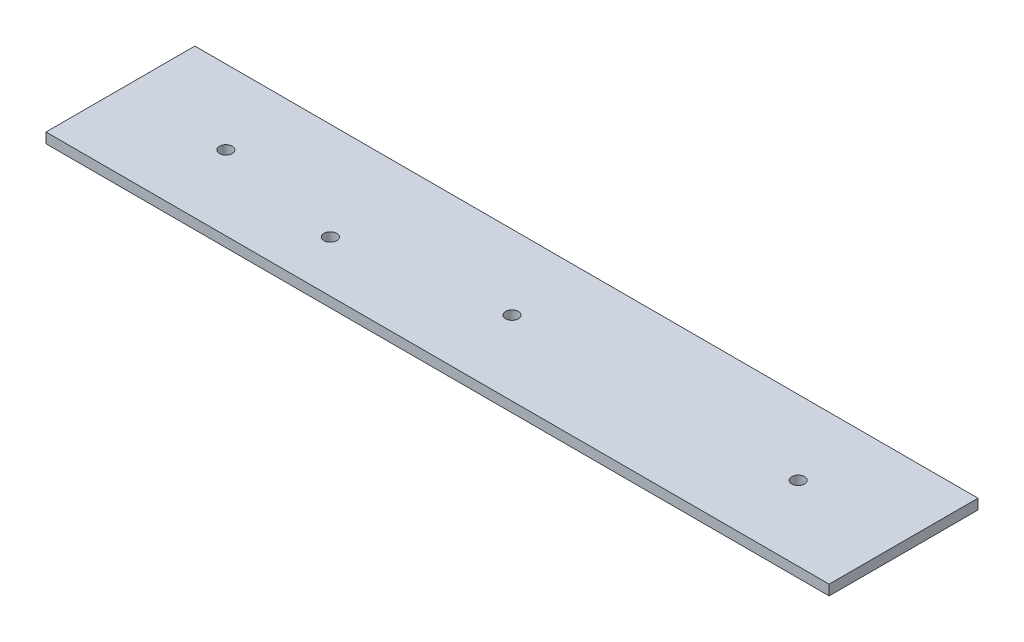
ISO-10303-21;
HEADER;
FILE_DESCRIPTION(('STEP AP214'),'2;1');
FILE_NAME('part.step','',(''),(''),'','','');
FILE_SCHEMA(('AUTOMOTIVE_DESIGN { 1 0 10303 214 1 1 1 1 }'));
ENDSEC;
DATA;
#1=APPLICATION_CONTEXT('core data for automotive mechanical design processes');
#2=APPLICATION_PROTOCOL_DEFINITION('international standard','automotive_design',2000,#1);
#3=PRODUCT_CONTEXT('',#1,'mechanical');
#4=PRODUCT('Part','Part','',(#3));
#5=PRODUCT_RELATED_PRODUCT_CATEGORY('part','',(#4));
#6=PRODUCT_DEFINITION_FORMATION('','',#4);
#7=PRODUCT_DEFINITION_CONTEXT('part definition',#1,'design');
#8=PRODUCT_DEFINITION('design','',#6,#7);
#9=PRODUCT_DEFINITION_SHAPE('','',#8);
#10=(LENGTH_UNIT() NAMED_UNIT(*) SI_UNIT(.MILLI.,.METRE.));
#11=(NAMED_UNIT(*) PLANE_ANGLE_UNIT() SI_UNIT($,.RADIAN.));
#12=(NAMED_UNIT(*) SI_UNIT($,.STERADIAN.) SOLID_ANGLE_UNIT());
#13=UNCERTAINTY_MEASURE_WITH_UNIT(LENGTH_MEASURE(1.E-05),#10,'distance_accuracy_value','');
#14=(GEOMETRIC_REPRESENTATION_CONTEXT(3) GLOBAL_UNCERTAINTY_ASSIGNED_CONTEXT((#13)) GLOBAL_UNIT_ASSIGNED_CONTEXT((#10,
#11,#12)) REPRESENTATION_CONTEXT('',''));
#15=CARTESIAN_POINT('',(0.,0.,0.));
#16=DIRECTION('',(0.,0.,1.));
#17=DIRECTION('',(1.,0.,0.));
#18=AXIS2_PLACEMENT_3D('',#15,#16,#17);
#19=CARTESIAN_POINT('',(0.,1.27,0.));
#20=DIRECTION('',(0.,-1.,0.));
#21=DIRECTION('',(0.,0.,-1.));
#22=AXIS2_PLACEMENT_3D('',#19,#20,#21);
#23=PLANE('',#22);
#24=CARTESIAN_POINT('',(0.,1.27,0.));
#25=DIRECTION('',(0.,1.,0.));
#26=DIRECTION('',(0.,0.,1.));
#27=AXIS2_PLACEMENT_3D('',#24,#25,#26);
#28=CIRCLE('',#27,1.5875);
#29=CARTESIAN_POINT('',(0.,1.27,1.5875));
#30=VERTEX_POINT('',#29);
#31=EDGE_CURVE('E120',#30,#30,#28,.T.);
#32=ORIENTED_EDGE('',*,*,#31,.F.);
#33=EDGE_LOOP('',(#32));
#34=FACE_BOUND('',#33,.T.);
#35=CARTESIAN_POINT('',(-71.,1.27,0.));
#36=DIRECTION('',(0.,1.,0.));
#37=DIRECTION('',(0.,0.,1.));
#38=AXIS2_PLACEMENT_3D('',#35,#36,#37);
#39=CIRCLE('',#38,1.58750000000007);
#40=CARTESIAN_POINT('',(-71.,1.27,1.58750000000007));
#41=VERTEX_POINT('',#40);
#42=EDGE_CURVE('E99',#41,#41,#39,.T.);
#43=ORIENTED_EDGE('',*,*,#42,.F.);
#44=EDGE_LOOP('',(#43));
#45=FACE_BOUND('',#44,.T.);
#46=DIRECTION('',(0.,0.,-1.));
#47=VECTOR('',#46,1.);
#48=CARTESIAN_POINT('',(97.1504374582062,1.27,18.4655866878851));
#49=LINE('',#48,#47);
#50=CARTESIAN_POINT('',(97.1504374582062,1.27,18.4655866878851));
#51=VERTEX_POINT('',#50);
#52=CARTESIAN_POINT('',(97.1504374582062,1.27,-18.4655866878852));
#53=VERTEX_POINT('',#52);
#54=EDGE_CURVE('E84',#51,#53,#49,.T.);
#55=ORIENTED_EDGE('',*,*,#54,.T.);
#56=DIRECTION('',(-1.,0.,0.));
#57=VECTOR('',#56,1.);
#58=CARTESIAN_POINT('',(-97.1504374582062,1.27,-18.4655866878852));
#59=LINE('',#58,#57);
#60=CARTESIAN_POINT('',(-97.1504374582062,1.27,-18.4655866878852));
#61=VERTEX_POINT('',#60);
#62=EDGE_CURVE('E79',#53,#61,#59,.T.);
#63=ORIENTED_EDGE('',*,*,#62,.T.);
#64=DIRECTION('',(0.,0.,1.));
#65=VECTOR('',#64,1.);
#66=CARTESIAN_POINT('',(-97.1504374582062,1.27,18.4655866878851));
#67=LINE('',#66,#65);
#68=CARTESIAN_POINT('',(-97.1504374582062,1.27,18.4655866878851));
#69=VERTEX_POINT('',#68);
#70=EDGE_CURVE('E82',#61,#69,#67,.T.);
#71=ORIENTED_EDGE('',*,*,#70,.T.);
#72=DIRECTION('',(1.,0.,0.));
#73=VECTOR('',#72,1.);
#74=CARTESIAN_POINT('',(-97.1504374582062,1.27,18.4655866878851));
#75=LINE('',#74,#73);
#76=EDGE_CURVE('E49',#69,#51,#75,.T.);
#77=ORIENTED_EDGE('',*,*,#76,.T.);
#78=EDGE_LOOP('',(#55,#63,#71,#77));
#79=FACE_BOUND('',#78,.T.);
#80=CARTESIAN_POINT('',(71.,1.27,0.));
#81=DIRECTION('',(0.,1.,0.));
#82=DIRECTION('',(0.,0.,1.));
#83=AXIS2_PLACEMENT_3D('',#80,#81,#82);
#84=CIRCLE('',#83,1.5875);
#85=CARTESIAN_POINT('',(71.,1.27,1.58749999999997));
#86=VERTEX_POINT('',#85);
#87=EDGE_CURVE('E114',#86,#86,#84,.T.);
#88=ORIENTED_EDGE('',*,*,#87,.F.);
#89=EDGE_LOOP('',(#88));
#90=FACE_BOUND('',#89,.T.);
#91=CARTESIAN_POINT('',(-39.31,1.27,5.75));
#92=DIRECTION('',(0.,1.,0.));
#93=DIRECTION('',(0.,0.,1.));
#94=AXIS2_PLACEMENT_3D('',#91,#92,#93);
#95=CIRCLE('',#94,1.5875);
#96=CARTESIAN_POINT('',(-39.31,1.27,7.3375));
#97=VERTEX_POINT('',#96);
#98=EDGE_CURVE('E126',#97,#97,#95,.T.);
#99=ORIENTED_EDGE('',*,*,#98,.F.);
#100=EDGE_LOOP('',(#99));
#101=FACE_BOUND('',#100,.T.);
#102=ADVANCED_FACE('F32',(#34,#45,#79,#90,#101),#23,.F.);
#103=CARTESIAN_POINT('',(0.,-1.27,0.));
#104=DIRECTION('',(0.,-1.,0.));
#105=DIRECTION('',(0.,0.,-1.));
#106=AXIS2_PLACEMENT_3D('',#103,#104,#105);
#107=PLANE('',#106);
#108=CARTESIAN_POINT('',(0.,-1.27,0.));
#109=DIRECTION('',(0.,1.,0.));
#110=DIRECTION('',(0.,0.,1.));
#111=AXIS2_PLACEMENT_3D('',#108,#109,#110);
#112=CIRCLE('',#111,1.5875);
#113=CARTESIAN_POINT('',(0.,-1.27,1.5875));
#114=VERTEX_POINT('',#113);
#115=EDGE_CURVE('E123',#114,#114,#112,.T.);
#116=ORIENTED_EDGE('',*,*,#115,.T.);
#117=EDGE_LOOP('',(#116));
#118=FACE_BOUND('',#117,.T.);
#119=CARTESIAN_POINT('',(-71.,-1.27,0.));
#120=DIRECTION('',(0.,1.,0.));
#121=DIRECTION('',(0.,0.,1.));
#122=AXIS2_PLACEMENT_3D('',#119,#120,#121);
#123=CIRCLE('',#122,1.58750000000007);
#124=CARTESIAN_POINT('',(-71.,-1.27,1.58750000000007));
#125=VERTEX_POINT('',#124);
#126=EDGE_CURVE('E111',#125,#125,#123,.T.);
#127=ORIENTED_EDGE('',*,*,#126,.T.);
#128=EDGE_LOOP('',(#127));
#129=FACE_BOUND('',#128,.T.);
#130=DIRECTION('',(0.,0.,-1.));
#131=VECTOR('',#130,1.);
#132=CARTESIAN_POINT('',(97.1504374582062,-1.27,18.4655866878851));
#133=LINE('',#132,#131);
#134=CARTESIAN_POINT('',(97.1504374582062,-1.27,18.4655866878851));
#135=VERTEX_POINT('',#134);
#136=CARTESIAN_POINT('',(97.1504374582062,-1.27,-18.4655866878852));
#137=VERTEX_POINT('',#136);
#138=EDGE_CURVE('E96',#135,#137,#133,.T.);
#139=ORIENTED_EDGE('',*,*,#138,.F.);
#140=DIRECTION('',(1.,0.,0.));
#141=VECTOR('',#140,1.);
#142=CARTESIAN_POINT('',(-97.1504374582062,-1.27,18.4655866878851));
#143=LINE('',#142,#141);
#144=CARTESIAN_POINT('',(-97.1504374582062,-1.27,18.4655866878851));
#145=VERTEX_POINT('',#144);
#146=EDGE_CURVE('E72',#145,#135,#143,.T.);
#147=ORIENTED_EDGE('',*,*,#146,.F.);
#148=DIRECTION('',(0.,0.,1.));
#149=VECTOR('',#148,1.);
#150=CARTESIAN_POINT('',(-97.1504374582062,-1.27,18.4655866878851));
#151=LINE('',#150,#149);
#152=CARTESIAN_POINT('',(-97.1504374582062,-1.27,-18.4655866878852));
#153=VERTEX_POINT('',#152);
#154=EDGE_CURVE('E66',#153,#145,#151,.T.);
#155=ORIENTED_EDGE('',*,*,#154,.F.);
#156=DIRECTION('',(-1.,0.,0.));
#157=VECTOR('',#156,1.);
#158=CARTESIAN_POINT('',(-97.1504374582062,-1.27,-18.4655866878852));
#159=LINE('',#158,#157);
#160=EDGE_CURVE('E88',#137,#153,#159,.T.);
#161=ORIENTED_EDGE('',*,*,#160,.F.);
#162=EDGE_LOOP('',(#139,#147,#155,#161));
#163=FACE_BOUND('',#162,.T.);
#164=CARTESIAN_POINT('',(71.,-1.27,0.));
#165=DIRECTION('',(0.,1.,0.));
#166=DIRECTION('',(0.,0.,1.));
#167=AXIS2_PLACEMENT_3D('',#164,#165,#166);
#168=CIRCLE('',#167,1.5875);
#169=CARTESIAN_POINT('',(71.,-1.27,1.58749999999997));
#170=VERTEX_POINT('',#169);
#171=EDGE_CURVE('E117',#170,#170,#168,.T.);
#172=ORIENTED_EDGE('',*,*,#171,.T.);
#173=EDGE_LOOP('',(#172));
#174=FACE_BOUND('',#173,.T.);
#175=CARTESIAN_POINT('',(-39.31,-1.27,5.75));
#176=DIRECTION('',(0.,1.,0.));
#177=DIRECTION('',(0.,0.,1.));
#178=AXIS2_PLACEMENT_3D('',#175,#176,#177);
#179=CIRCLE('',#178,1.5875);
#180=CARTESIAN_POINT('',(-39.31,-1.27,7.3375));
#181=VERTEX_POINT('',#180);
#182=EDGE_CURVE('E129',#181,#181,#179,.T.);
#183=ORIENTED_EDGE('',*,*,#182,.T.);
#184=EDGE_LOOP('',(#183));
#185=FACE_BOUND('',#184,.T.);
#186=ADVANCED_FACE('F107',(#118,#129,#163,#174,#185),#107,.T.);
#187=CARTESIAN_POINT('',(97.1504374582062,1.27,18.4655866878851));
#188=DIRECTION('',(-1.,0.,0.));
#189=DIRECTION('',(0.,0.,1.));
#190=AXIS2_PLACEMENT_3D('',#187,#188,#189);
#191=PLANE('',#190);
#192=ORIENTED_EDGE('',*,*,#138,.T.);
#193=DIRECTION('',(0.,-1.,0.));
#194=VECTOR('',#193,1.);
#195=CARTESIAN_POINT('',(97.1504374582062,1.27,-18.4655866878852));
#196=LINE('',#195,#194);
#197=EDGE_CURVE('E11',#53,#137,#196,.T.);
#198=ORIENTED_EDGE('',*,*,#197,.F.);
#199=ORIENTED_EDGE('',*,*,#54,.F.);
#200=DIRECTION('',(0.,-1.,0.));
#201=VECTOR('',#200,1.);
#202=CARTESIAN_POINT('',(97.1504374582062,1.27,18.4655866878851));
#203=LINE('',#202,#201);
#204=EDGE_CURVE('E92',#51,#135,#203,.T.);
#205=ORIENTED_EDGE('',*,*,#204,.T.);
#206=EDGE_LOOP('',(#192,#198,#199,#205));
#207=FACE_BOUND('',#206,.T.);
#208=ADVANCED_FACE('F34',(#207),#191,.F.);
#209=CARTESIAN_POINT('',(-97.1504374582062,1.27,-18.4655866878852));
#210=DIRECTION('',(0.,0.,1.));
#211=DIRECTION('',(1.,0.,0.));
#212=AXIS2_PLACEMENT_3D('',#209,#210,#211);
#213=PLANE('',#212);
#214=ORIENTED_EDGE('',*,*,#160,.T.);
#215=DIRECTION('',(0.,-1.,0.));
#216=VECTOR('',#215,1.);
#217=CARTESIAN_POINT('',(-97.1504374582062,1.27,-18.4655866878852));
#218=LINE('',#217,#216);
#219=EDGE_CURVE('E41',#61,#153,#218,.T.);
#220=ORIENTED_EDGE('',*,*,#219,.F.);
#221=ORIENTED_EDGE('',*,*,#62,.F.);
#222=ORIENTED_EDGE('',*,*,#197,.T.);
#223=EDGE_LOOP('',(#214,#220,#221,#222));
#224=FACE_BOUND('',#223,.T.);
#225=ADVANCED_FACE('F87',(#224),#213,.F.);
#226=CARTESIAN_POINT('',(-97.1504374582062,1.27,18.4655866878851));
#227=DIRECTION('',(1.,0.,0.));
#228=DIRECTION('',(0.,0.,-1.));
#229=AXIS2_PLACEMENT_3D('',#226,#227,#228);
#230=PLANE('',#229);
#231=ORIENTED_EDGE('',*,*,#154,.T.);
#232=DIRECTION('',(0.,-1.,0.));
#233=VECTOR('',#232,1.);
#234=CARTESIAN_POINT('',(-97.1504374582062,1.27,18.4655866878851));
#235=LINE('',#234,#233);
#236=EDGE_CURVE('E89',#69,#145,#235,.T.);
#237=ORIENTED_EDGE('',*,*,#236,.F.);
#238=ORIENTED_EDGE('',*,*,#70,.F.);
#239=ORIENTED_EDGE('',*,*,#219,.T.);
#240=EDGE_LOOP('',(#231,#237,#238,#239));
#241=FACE_BOUND('',#240,.T.);
#242=ADVANCED_FACE('F90',(#241),#230,.F.);
#243=CARTESIAN_POINT('',(-97.1504374582062,1.27,18.4655866878851));
#244=DIRECTION('',(0.,0.,-1.));
#245=DIRECTION('',(-1.,0.,0.));
#246=AXIS2_PLACEMENT_3D('',#243,#244,#245);
#247=PLANE('',#246);
#248=ORIENTED_EDGE('',*,*,#146,.T.);
#249=ORIENTED_EDGE('',*,*,#204,.F.);
#250=ORIENTED_EDGE('',*,*,#76,.F.);
#251=ORIENTED_EDGE('',*,*,#236,.T.);
#252=EDGE_LOOP('',(#248,#249,#250,#251));
#253=FACE_BOUND('',#252,.T.);
#254=ADVANCED_FACE('F104',(#253),#247,.F.);
#255=CARTESIAN_POINT('',(-71.,1.27,0.));
#256=DIRECTION('',(0.,-1.,0.));
#257=DIRECTION('',(0.,0.,-1.));
#258=AXIS2_PLACEMENT_3D('',#255,#256,#257);
#259=CYLINDRICAL_SURFACE('',#258,1.58750000000007);
#260=ORIENTED_EDGE('',*,*,#42,.T.);
#261=EDGE_LOOP('',(#260));
#262=FACE_BOUND('',#261,.T.);
#263=ORIENTED_EDGE('',*,*,#126,.F.);
#264=EDGE_LOOP('',(#263));
#265=FACE_BOUND('',#264,.T.);
#266=ADVANCED_FACE('F149',(#262,#265),#259,.F.);
#267=CARTESIAN_POINT('',(71.,1.27,0.));
#268=DIRECTION('',(0.,-1.,0.));
#269=DIRECTION('',(0.,0.,-1.));
#270=AXIS2_PLACEMENT_3D('',#267,#268,#269);
#271=CYLINDRICAL_SURFACE('',#270,1.5875);
#272=ORIENTED_EDGE('',*,*,#87,.T.);
#273=EDGE_LOOP('',(#272));
#274=FACE_BOUND('',#273,.T.);
#275=ORIENTED_EDGE('',*,*,#171,.F.);
#276=EDGE_LOOP('',(#275));
#277=FACE_BOUND('',#276,.T.);
#278=ADVANCED_FACE('F195',(#274,#277),#271,.F.);
#279=CARTESIAN_POINT('',(0.,1.27,0.));
#280=DIRECTION('',(0.,-1.,0.));
#281=DIRECTION('',(0.,0.,-1.));
#282=AXIS2_PLACEMENT_3D('',#279,#280,#281);
#283=CYLINDRICAL_SURFACE('',#282,1.5875);
#284=ORIENTED_EDGE('',*,*,#31,.T.);
#285=EDGE_LOOP('',(#284));
#286=FACE_BOUND('',#285,.T.);
#287=ORIENTED_EDGE('',*,*,#115,.F.);
#288=EDGE_LOOP('',(#287));
#289=FACE_BOUND('',#288,.T.);
#290=ADVANCED_FACE('F203',(#286,#289),#283,.F.);
#291=CARTESIAN_POINT('',(-39.31,1.27,5.75));
#292=DIRECTION('',(0.,-1.,0.));
#293=DIRECTION('',(0.,0.,-1.));
#294=AXIS2_PLACEMENT_3D('',#291,#292,#293);
#295=CYLINDRICAL_SURFACE('',#294,1.5875);
#296=ORIENTED_EDGE('',*,*,#98,.T.);
#297=EDGE_LOOP('',(#296));
#298=FACE_BOUND('',#297,.T.);
#299=ORIENTED_EDGE('',*,*,#182,.F.);
#300=EDGE_LOOP('',(#299));
#301=FACE_BOUND('',#300,.T.);
#302=ADVANCED_FACE('F135',(#298,#301),#295,.F.);
#303=CLOSED_SHELL('',(#102,#186,#208,#225,#242,#254,#266,#278,#290,#302));
#304=MANIFOLD_SOLID_BREP('B2',#303);
#305=ADVANCED_BREP_SHAPE_REPRESENTATION('',(#18,#304),#14);
#306=SHAPE_DEFINITION_REPRESENTATION(#9,#305);
ENDSEC;
END-ISO-10303-21;
